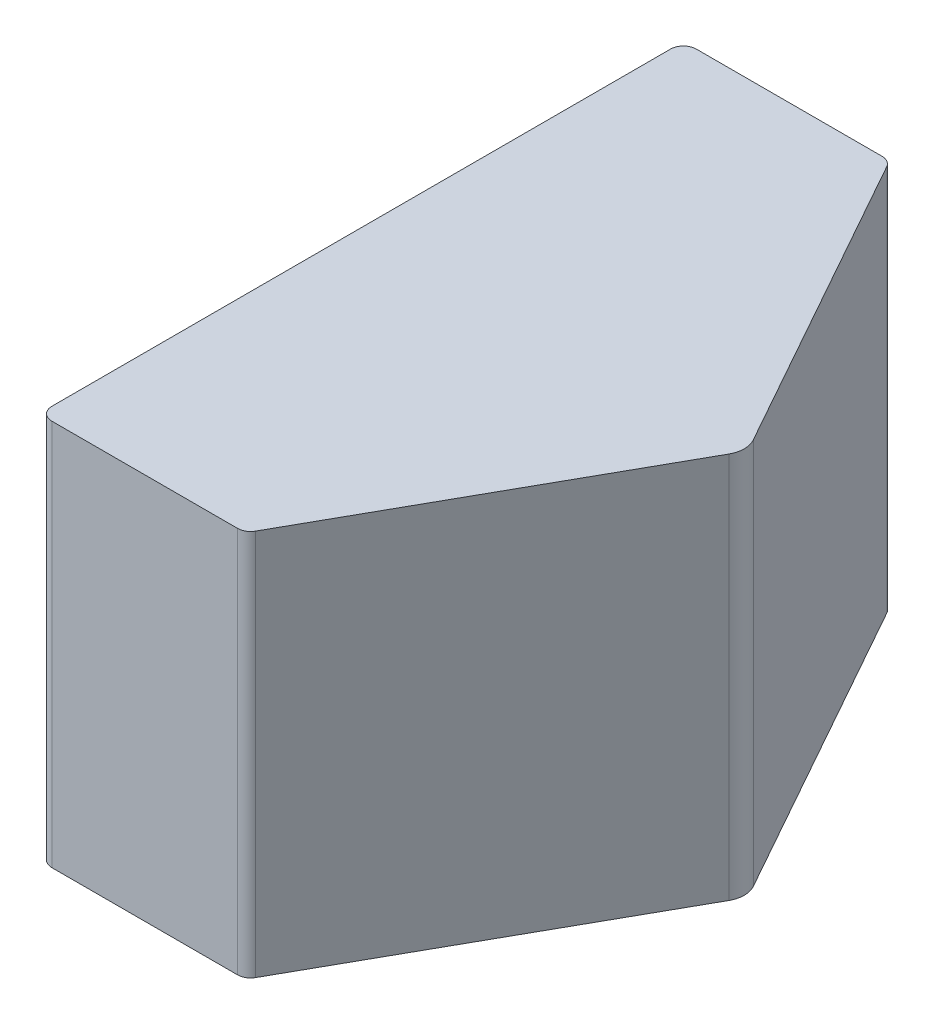
ISO-10303-21;
HEADER;
FILE_DESCRIPTION(('STEP AP214'),'2;1');
FILE_NAME('part.step','',(''),(''),'','','');
FILE_SCHEMA(('AUTOMOTIVE_DESIGN { 1 0 10303 214 1 1 1 1 }'));
ENDSEC;
DATA;
#1=APPLICATION_CONTEXT('core data for automotive mechanical design processes');
#2=APPLICATION_PROTOCOL_DEFINITION('international standard','automotive_design',2000,#1);
#3=PRODUCT_CONTEXT('',#1,'mechanical');
#4=PRODUCT('Part','Part','',(#3));
#5=PRODUCT_RELATED_PRODUCT_CATEGORY('part','',(#4));
#6=PRODUCT_DEFINITION_FORMATION('','',#4);
#7=PRODUCT_DEFINITION_CONTEXT('part definition',#1,'design');
#8=PRODUCT_DEFINITION('design','',#6,#7);
#9=PRODUCT_DEFINITION_SHAPE('','',#8);
#10=(LENGTH_UNIT() NAMED_UNIT(*) SI_UNIT(.MILLI.,.METRE.));
#11=(NAMED_UNIT(*) PLANE_ANGLE_UNIT() SI_UNIT($,.RADIAN.));
#12=(NAMED_UNIT(*) SI_UNIT($,.STERADIAN.) SOLID_ANGLE_UNIT());
#13=UNCERTAINTY_MEASURE_WITH_UNIT(LENGTH_MEASURE(1.E-05),#10,'distance_accuracy_value','');
#14=(GEOMETRIC_REPRESENTATION_CONTEXT(3) GLOBAL_UNCERTAINTY_ASSIGNED_CONTEXT((#13)) GLOBAL_UNIT_ASSIGNED_CONTEXT((#10,
#11,#12)) REPRESENTATION_CONTEXT('',''));
#15=CARTESIAN_POINT('',(0.,0.,0.));
#16=DIRECTION('',(0.,0.,1.));
#17=DIRECTION('',(1.,0.,0.));
#18=AXIS2_PLACEMENT_3D('',#15,#16,#17);
#19=CARTESIAN_POINT('',(138.907318907006,150.,125.));
#20=DIRECTION('',(0.,-1.,0.));
#21=DIRECTION('',(0.,0.,-1.));
#22=AXIS2_PLACEMENT_3D('',#19,#20,#21);
#23=CYLINDRICAL_SURFACE('',#22,9.67843098664906);
#24=CARTESIAN_POINT('',(138.907318907006,0.,125.));
#25=DIRECTION('',(0.,1.,0.));
#26=DIRECTION('',(0.,0.,1.));
#27=AXIS2_PLACEMENT_3D('',#24,#25,#26);
#28=CIRCLE('',#27,9.67843098664906);
#29=CARTESIAN_POINT('',(147.351808167811,0.,129.728913986051));
#30=VERTEX_POINT('',#29);
#31=CARTESIAN_POINT('',(147.351808167811,0.,120.271086013949));
#32=VERTEX_POINT('',#31);
#33=EDGE_CURVE('E159',#30,#32,#28,.T.);
#34=ORIENTED_EDGE('',*,*,#33,.T.);
#35=DIRECTION('',(0.,-1.,0.));
#36=VECTOR('',#35,1.);
#37=CARTESIAN_POINT('',(147.351808167811,150.,120.271086013949));
#38=LINE('',#37,#36);
#39=CARTESIAN_POINT('',(147.351808167811,150.,120.271086013949));
#40=VERTEX_POINT('',#39);
#41=EDGE_CURVE('E11',#40,#32,#38,.T.);
#42=ORIENTED_EDGE('',*,*,#41,.F.);
#43=CARTESIAN_POINT('',(138.907318907006,150.,125.));
#44=DIRECTION('',(0.,1.,0.));
#45=DIRECTION('',(0.,0.,1.));
#46=AXIS2_PLACEMENT_3D('',#43,#44,#45);
#47=CIRCLE('',#46,9.67843098664906);
#48=CARTESIAN_POINT('',(147.351808167811,150.,129.728913986051));
#49=VERTEX_POINT('',#48);
#50=EDGE_CURVE('E181',#49,#40,#47,.T.);
#51=ORIENTED_EDGE('',*,*,#50,.F.);
#52=DIRECTION('',(0.,-1.,0.));
#53=VECTOR('',#52,1.);
#54=CARTESIAN_POINT('',(147.351808167811,150.,129.728913986051));
#55=LINE('',#54,#53);
#56=EDGE_CURVE('E155',#49,#30,#55,.T.);
#57=ORIENTED_EDGE('',*,*,#56,.T.);
#58=EDGE_LOOP('',(#34,#42,#51,#57));
#59=FACE_BOUND('',#58,.T.);
#60=ADVANCED_FACE('F39',(#59),#23,.T.);
#61=CARTESIAN_POINT('',(81.4319105669908,150.,2.5569831553408));
#62=DIRECTION('',(-0.87250601594972,0.,0.488603368931844));
#63=DIRECTION('',(0.488603368931844,0.,0.87250601594972));
#64=AXIS2_PLACEMENT_3D('',#61,#62,#63);
#65=PLANE('',#64);
#66=DIRECTION('',(-0.488603368931844,0.,-0.87250601594972));
#67=VECTOR('',#66,1.);
#68=CARTESIAN_POINT('',(81.4319105669908,0.,2.5569831553408));
#69=LINE('',#68,#67);
#70=CARTESIAN_POINT('',(81.4319105669908,0.,2.5569831553408));
#71=VERTEX_POINT('',#70);
#72=EDGE_CURVE('E162',#32,#71,#69,.T.);
#73=ORIENTED_EDGE('',*,*,#72,.T.);
#74=DIRECTION('',(0.,-1.,0.));
#75=VECTOR('',#74,1.);
#76=CARTESIAN_POINT('',(81.4319105669908,150.,2.5569831553408));
#77=LINE('',#76,#75);
#78=CARTESIAN_POINT('',(81.4319105669908,150.,2.5569831553408));
#79=VERTEX_POINT('',#78);
#80=EDGE_CURVE('E46',#79,#71,#77,.T.);
#81=ORIENTED_EDGE('',*,*,#80,.F.);
#82=DIRECTION('',(-0.488603368931844,0.,-0.87250601594972));
#83=VECTOR('',#82,1.);
#84=CARTESIAN_POINT('',(81.4319105669908,150.,2.5569831553408));
#85=LINE('',#84,#83);
#86=EDGE_CURVE('E109',#40,#79,#85,.T.);
#87=ORIENTED_EDGE('',*,*,#86,.F.);
#88=ORIENTED_EDGE('',*,*,#41,.T.);
#89=EDGE_LOOP('',(#73,#81,#87,#88));
#90=FACE_BOUND('',#89,.T.);
#91=ADVANCED_FACE('F292',(#90),#65,.F.);
#92=CARTESIAN_POINT('',(77.0693804872422,150.,5.));
#93=DIRECTION('',(0.,-1.,0.));
#94=DIRECTION('',(0.,0.,-1.));
#95=AXIS2_PLACEMENT_3D('',#92,#93,#94);
#96=CYLINDRICAL_SURFACE('',#95,5.00000000000001);
#97=CARTESIAN_POINT('',(77.0693804872422,0.,5.));
#98=DIRECTION('',(0.,1.,0.));
#99=DIRECTION('',(0.,0.,-1.));
#100=AXIS2_PLACEMENT_3D('',#97,#98,#99);
#101=CIRCLE('',#100,5.00000000000001);
#102=CARTESIAN_POINT('',(77.0693804872422,0.,0.));
#103=VERTEX_POINT('',#102);
#104=EDGE_CURVE('E165',#71,#103,#101,.T.);
#105=ORIENTED_EDGE('',*,*,#104,.T.);
#106=DIRECTION('',(0.,-1.,0.));
#107=VECTOR('',#106,1.);
#108=CARTESIAN_POINT('',(77.0693804872422,150.,0.));
#109=LINE('',#108,#107);
#110=CARTESIAN_POINT('',(77.0693804872422,150.,0.));
#111=VERTEX_POINT('',#110);
#112=EDGE_CURVE('E194',#111,#103,#109,.T.);
#113=ORIENTED_EDGE('',*,*,#112,.F.);
#114=CARTESIAN_POINT('',(77.0693804872422,150.,5.));
#115=DIRECTION('',(0.,1.,0.));
#116=DIRECTION('',(0.,0.,-1.));
#117=AXIS2_PLACEMENT_3D('',#114,#115,#116);
#118=CIRCLE('',#117,5.00000000000001);
#119=EDGE_CURVE('E202',#79,#111,#118,.T.);
#120=ORIENTED_EDGE('',*,*,#119,.F.);
#121=ORIENTED_EDGE('',*,*,#80,.T.);
#122=EDGE_LOOP('',(#105,#113,#120,#121));
#123=FACE_BOUND('',#122,.T.);
#124=ADVANCED_FACE('F200',(#123),#96,.T.);
#125=CARTESIAN_POINT('',(5.00000000000004,150.,0.));
#126=DIRECTION('',(0.,0.,1.));
#127=DIRECTION('',(1.,0.,0.));
#128=AXIS2_PLACEMENT_3D('',#125,#126,#127);
#129=PLANE('',#128);
#130=DIRECTION('',(-1.,0.,0.));
#131=VECTOR('',#130,1.);
#132=CARTESIAN_POINT('',(5.00000000000004,0.,0.));
#133=LINE('',#132,#131);
#134=CARTESIAN_POINT('',(5.,0.,0.));
#135=VERTEX_POINT('',#134);
#136=EDGE_CURVE('E167',#103,#135,#133,.T.);
#137=ORIENTED_EDGE('',*,*,#136,.T.);
#138=DIRECTION('',(0.,-1.,0.));
#139=VECTOR('',#138,1.);
#140=CARTESIAN_POINT('',(5.,150.,0.));
#141=LINE('',#140,#139);
#142=CARTESIAN_POINT('',(5.,150.,0.));
#143=VERTEX_POINT('',#142);
#144=EDGE_CURVE('E191',#143,#135,#141,.T.);
#145=ORIENTED_EDGE('',*,*,#144,.F.);
#146=DIRECTION('',(-1.,0.,0.));
#147=VECTOR('',#146,1.);
#148=CARTESIAN_POINT('',(5.00000000000004,150.,0.));
#149=LINE('',#148,#147);
#150=EDGE_CURVE('E221',#111,#143,#149,.T.);
#151=ORIENTED_EDGE('',*,*,#150,.F.);
#152=ORIENTED_EDGE('',*,*,#112,.T.);
#153=EDGE_LOOP('',(#137,#145,#151,#152));
#154=FACE_BOUND('',#153,.T.);
#155=ADVANCED_FACE('F212',(#154),#129,.F.);
#156=CARTESIAN_POINT('',(5.,150.,5.));
#157=DIRECTION('',(0.,-1.,0.));
#158=DIRECTION('',(0.,0.,-1.));
#159=AXIS2_PLACEMENT_3D('',#156,#157,#158);
#160=CYLINDRICAL_SURFACE('',#159,5.);
#161=CARTESIAN_POINT('',(5.,0.,5.));
#162=DIRECTION('',(0.,1.,0.));
#163=DIRECTION('',(0.,0.,-1.));
#164=AXIS2_PLACEMENT_3D('',#161,#162,#163);
#165=CIRCLE('',#164,5.);
#166=CARTESIAN_POINT('',(0.,0.,5.00000000000004));
#167=VERTEX_POINT('',#166);
#168=EDGE_CURVE('E169',#135,#167,#165,.T.);
#169=ORIENTED_EDGE('',*,*,#168,.T.);
#170=DIRECTION('',(0.,-1.,0.));
#171=VECTOR('',#170,1.);
#172=CARTESIAN_POINT('',(0.,150.,5.00000000000004));
#173=LINE('',#172,#171);
#174=CARTESIAN_POINT('',(0.,150.,5.00000000000004));
#175=VERTEX_POINT('',#174);
#176=EDGE_CURVE('E188',#175,#167,#173,.T.);
#177=ORIENTED_EDGE('',*,*,#176,.F.);
#178=CARTESIAN_POINT('',(5.,150.,5.));
#179=DIRECTION('',(0.,1.,0.));
#180=DIRECTION('',(0.,0.,-1.));
#181=AXIS2_PLACEMENT_3D('',#178,#179,#180);
#182=CIRCLE('',#181,5.);
#183=EDGE_CURVE('E218',#143,#175,#182,.T.);
#184=ORIENTED_EDGE('',*,*,#183,.F.);
#185=ORIENTED_EDGE('',*,*,#144,.T.);
#186=EDGE_LOOP('',(#169,#177,#184,#185));
#187=FACE_BOUND('',#186,.T.);
#188=ADVANCED_FACE('F216',(#187),#160,.T.);
#189=CARTESIAN_POINT('',(0.,150.,5.00000000000004));
#190=DIRECTION('',(1.,0.,0.));
#191=DIRECTION('',(0.,0.,-1.));
#192=AXIS2_PLACEMENT_3D('',#189,#190,#191);
#193=PLANE('',#192);
#194=DIRECTION('',(0.,0.,1.));
#195=VECTOR('',#194,1.);
#196=CARTESIAN_POINT('',(0.,0.,5.00000000000004));
#197=LINE('',#196,#195);
#198=CARTESIAN_POINT('',(0.,0.,85.));
#199=VERTEX_POINT('',#198);
#200=EDGE_CURVE('E172',#167,#199,#197,.T.);
#201=ORIENTED_EDGE('',*,*,#200,.T.);
#202=DIRECTION('',(0.,-1.,0.));
#203=VECTOR('',#202,1.);
#204=CARTESIAN_POINT('',(0.,80.,85.));
#205=LINE('',#204,#203);
#206=CARTESIAN_POINT('',(0.,80.,85.));
#207=VERTEX_POINT('',#206);
#208=EDGE_CURVE('E247',#207,#199,#205,.T.);
#209=ORIENTED_EDGE('',*,*,#208,.F.);
#210=DIRECTION('',(0.,0.,-1.));
#211=VECTOR('',#210,1.);
#212=CARTESIAN_POINT('',(0.,80.,85.));
#213=LINE('',#212,#211);
#214=CARTESIAN_POINT('',(0.,80.,165.));
#215=VERTEX_POINT('',#214);
#216=EDGE_CURVE('E241',#215,#207,#213,.T.);
#217=ORIENTED_EDGE('',*,*,#216,.F.);
#218=DIRECTION('',(0.,1.,0.));
#219=VECTOR('',#218,1.);
#220=CARTESIAN_POINT('',(0.,80.,165.));
#221=LINE('',#220,#219);
#222=CARTESIAN_POINT('',(0.,0.,165.));
#223=VERTEX_POINT('',#222);
#224=EDGE_CURVE('E244',#223,#215,#221,.T.);
#225=ORIENTED_EDGE('',*,*,#224,.F.);
#226=CARTESIAN_POINT('',(0.,0.,245.));
#227=VERTEX_POINT('',#226);
#228=EDGE_CURVE('E171',#223,#227,#197,.T.);
#229=ORIENTED_EDGE('',*,*,#228,.T.);
#230=DIRECTION('',(0.,-1.,0.));
#231=VECTOR('',#230,1.);
#232=CARTESIAN_POINT('',(0.,150.,245.));
#233=LINE('',#232,#231);
#234=CARTESIAN_POINT('',(0.,150.,245.));
#235=VERTEX_POINT('',#234);
#236=EDGE_CURVE('E185',#235,#227,#233,.T.);
#237=ORIENTED_EDGE('',*,*,#236,.F.);
#238=DIRECTION('',(0.,0.,1.));
#239=VECTOR('',#238,1.);
#240=CARTESIAN_POINT('',(0.,150.,5.00000000000004));
#241=LINE('',#240,#239);
#242=EDGE_CURVE('E220',#175,#235,#241,.T.);
#243=ORIENTED_EDGE('',*,*,#242,.F.);
#244=ORIENTED_EDGE('',*,*,#176,.T.);
#245=EDGE_LOOP('',(#201,#209,#217,#225,#229,#237,#243,#244));
#246=FACE_BOUND('',#245,.T.);
#247=ADVANCED_FACE('F275',(#246),#193,.F.);
#248=CARTESIAN_POINT('',(5.00000000000003,150.,245.));
#249=DIRECTION('',(0.,-1.,0.));
#250=DIRECTION('',(0.,0.,-1.));
#251=AXIS2_PLACEMENT_3D('',#248,#249,#250);
#252=CYLINDRICAL_SURFACE('',#251,5.);
#253=CARTESIAN_POINT('',(5.00000000000003,0.,245.));
#254=DIRECTION('',(0.,1.,0.));
#255=DIRECTION('',(0.,0.,1.));
#256=AXIS2_PLACEMENT_3D('',#253,#254,#255);
#257=CIRCLE('',#256,5.);
#258=CARTESIAN_POINT('',(5.00000000000003,0.,250.));
#259=VERTEX_POINT('',#258);
#260=EDGE_CURVE('E175',#227,#259,#257,.T.);
#261=ORIENTED_EDGE('',*,*,#260,.T.);
#262=DIRECTION('',(0.,-1.,0.));
#263=VECTOR('',#262,1.);
#264=CARTESIAN_POINT('',(5.00000000000003,150.,250.));
#265=LINE('',#264,#263);
#266=CARTESIAN_POINT('',(5.00000000000003,150.,250.));
#267=VERTEX_POINT('',#266);
#268=EDGE_CURVE('E150',#267,#259,#265,.T.);
#269=ORIENTED_EDGE('',*,*,#268,.F.);
#270=CARTESIAN_POINT('',(5.00000000000003,150.,245.));
#271=DIRECTION('',(0.,1.,0.));
#272=DIRECTION('',(0.,0.,1.));
#273=AXIS2_PLACEMENT_3D('',#270,#271,#272);
#274=CIRCLE('',#273,5.);
#275=EDGE_CURVE('E138',#235,#267,#274,.T.);
#276=ORIENTED_EDGE('',*,*,#275,.F.);
#277=ORIENTED_EDGE('',*,*,#236,.T.);
#278=EDGE_LOOP('',(#261,#269,#276,#277));
#279=FACE_BOUND('',#278,.T.);
#280=ADVANCED_FACE('F287',(#279),#252,.T.);
#281=CARTESIAN_POINT('',(5.00000000000003,150.,250.));
#282=DIRECTION('',(0.,0.,-1.));
#283=DIRECTION('',(-1.,0.,0.));
#284=AXIS2_PLACEMENT_3D('',#281,#282,#283);
#285=PLANE('',#284);
#286=DIRECTION('',(1.,0.,0.));
#287=VECTOR('',#286,1.);
#288=CARTESIAN_POINT('',(5.00000000000003,0.,250.));
#289=LINE('',#288,#287);
#290=CARTESIAN_POINT('',(77.0693804872422,0.,250.));
#291=VERTEX_POINT('',#290);
#292=EDGE_CURVE('E147',#259,#291,#289,.T.);
#293=ORIENTED_EDGE('',*,*,#292,.T.);
#294=DIRECTION('',(0.,-1.,0.));
#295=VECTOR('',#294,1.);
#296=CARTESIAN_POINT('',(77.0693804872422,150.,250.));
#297=LINE('',#296,#295);
#298=CARTESIAN_POINT('',(77.0693804872422,150.,250.));
#299=VERTEX_POINT('',#298);
#300=EDGE_CURVE('E144',#299,#291,#297,.T.);
#301=ORIENTED_EDGE('',*,*,#300,.F.);
#302=DIRECTION('',(1.,0.,0.));
#303=VECTOR('',#302,1.);
#304=CARTESIAN_POINT('',(5.00000000000003,150.,250.));
#305=LINE('',#304,#303);
#306=EDGE_CURVE('E131',#267,#299,#305,.T.);
#307=ORIENTED_EDGE('',*,*,#306,.F.);
#308=ORIENTED_EDGE('',*,*,#268,.T.);
#309=EDGE_LOOP('',(#293,#301,#307,#308));
#310=FACE_BOUND('',#309,.T.);
#311=ADVANCED_FACE('F145',(#310),#285,.F.);
#312=CARTESIAN_POINT('',(77.0693804872422,150.,245.));
#313=DIRECTION('',(0.,-1.,0.));
#314=DIRECTION('',(0.,0.,-1.));
#315=AXIS2_PLACEMENT_3D('',#312,#313,#314);
#316=CYLINDRICAL_SURFACE('',#315,5.00000000000001);
#317=CARTESIAN_POINT('',(77.0693804872422,0.,245.));
#318=DIRECTION('',(0.,1.,0.));
#319=DIRECTION('',(0.,0.,-1.));
#320=AXIS2_PLACEMENT_3D('',#317,#318,#319);
#321=CIRCLE('',#320,5.00000000000001);
#322=CARTESIAN_POINT('',(81.4319105669908,0.,247.443016844659));
#323=VERTEX_POINT('',#322);
#324=EDGE_CURVE('E178',#291,#323,#321,.T.);
#325=ORIENTED_EDGE('',*,*,#324,.T.);
#326=DIRECTION('',(0.,-1.,0.));
#327=VECTOR('',#326,1.);
#328=CARTESIAN_POINT('',(81.4319105669908,150.,247.443016844659));
#329=LINE('',#328,#327);
#330=CARTESIAN_POINT('',(81.4319105669908,150.,247.443016844659));
#331=VERTEX_POINT('',#330);
#332=EDGE_CURVE('E151',#331,#323,#329,.T.);
#333=ORIENTED_EDGE('',*,*,#332,.F.);
#334=CARTESIAN_POINT('',(77.0693804872422,150.,245.));
#335=DIRECTION('',(0.,1.,0.));
#336=DIRECTION('',(0.,0.,-1.));
#337=AXIS2_PLACEMENT_3D('',#334,#335,#336);
#338=CIRCLE('',#337,5.00000000000001);
#339=EDGE_CURVE('E135',#299,#331,#338,.T.);
#340=ORIENTED_EDGE('',*,*,#339,.F.);
#341=ORIENTED_EDGE('',*,*,#300,.T.);
#342=EDGE_LOOP('',(#325,#333,#340,#341));
#343=FACE_BOUND('',#342,.T.);
#344=ADVANCED_FACE('F153',(#343),#316,.T.);
#345=CARTESIAN_POINT('',(147.351808167811,150.,129.728913986051));
#346=DIRECTION('',(-0.87250601594972,0.,-0.488603368931844));
#347=DIRECTION('',(-0.488603368931844,0.,0.87250601594972));
#348=AXIS2_PLACEMENT_3D('',#345,#346,#347);
#349=PLANE('',#348);
#350=DIRECTION('',(0.488603368931844,0.,-0.87250601594972));
#351=VECTOR('',#350,1.);
#352=CARTESIAN_POINT('',(147.351808167811,0.,129.728913986051));
#353=LINE('',#352,#351);
#354=EDGE_CURVE('E101',#323,#30,#353,.T.);
#355=ORIENTED_EDGE('',*,*,#354,.T.);
#356=ORIENTED_EDGE('',*,*,#56,.F.);
#357=DIRECTION('',(0.488603368931844,0.,-0.87250601594972));
#358=VECTOR('',#357,1.);
#359=CARTESIAN_POINT('',(147.351808167811,150.,129.728913986051));
#360=LINE('',#359,#358);
#361=EDGE_CURVE('E62',#331,#49,#360,.T.);
#362=ORIENTED_EDGE('',*,*,#361,.F.);
#363=ORIENTED_EDGE('',*,*,#332,.T.);
#364=EDGE_LOOP('',(#355,#356,#362,#363));
#365=FACE_BOUND('',#364,.T.);
#366=ADVANCED_FACE('F288',(#365),#349,.F.);
#367=CARTESIAN_POINT('',(138.907318907006,150.,125.));
#368=DIRECTION('',(0.,1.,0.));
#369=DIRECTION('',(0.,0.,1.));
#370=AXIS2_PLACEMENT_3D('',#367,#368,#369);
#371=PLANE('',#370);
#372=ORIENTED_EDGE('',*,*,#50,.T.);
#373=ORIENTED_EDGE('',*,*,#86,.T.);
#374=ORIENTED_EDGE('',*,*,#119,.T.);
#375=ORIENTED_EDGE('',*,*,#150,.T.);
#376=ORIENTED_EDGE('',*,*,#183,.T.);
#377=ORIENTED_EDGE('',*,*,#242,.T.);
#378=ORIENTED_EDGE('',*,*,#275,.T.);
#379=ORIENTED_EDGE('',*,*,#306,.T.);
#380=ORIENTED_EDGE('',*,*,#339,.T.);
#381=ORIENTED_EDGE('',*,*,#361,.T.);
#382=EDGE_LOOP('',(#372,#373,#374,#375,#376,#377,#378,#379,#380,#381));
#383=FACE_BOUND('',#382,.T.);
#384=ADVANCED_FACE('F133',(#383),#371,.T.);
#385=CARTESIAN_POINT('',(138.907318907006,0.,125.));
#386=DIRECTION('',(0.,1.,0.));
#387=DIRECTION('',(0.,0.,1.));
#388=AXIS2_PLACEMENT_3D('',#385,#386,#387);
#389=PLANE('',#388);
#390=DIRECTION('',(0.,0.,1.));
#391=VECTOR('',#390,1.);
#392=CARTESIAN_POINT('',(100.,0.,85.));
#393=LINE('',#392,#391);
#394=CARTESIAN_POINT('',(100.,0.,85.));
#395=VERTEX_POINT('',#394);
#396=CARTESIAN_POINT('',(100.,0.,165.));
#397=VERTEX_POINT('',#396);
#398=EDGE_CURVE('E254',#395,#397,#393,.T.);
#399=ORIENTED_EDGE('',*,*,#398,.F.);
#400=DIRECTION('',(-1.,0.,0.));
#401=VECTOR('',#400,1.);
#402=CARTESIAN_POINT('',(100.,0.,85.));
#403=LINE('',#402,#401);
#404=EDGE_CURVE('E229',#395,#199,#403,.T.);
#405=ORIENTED_EDGE('',*,*,#404,.T.);
#406=ORIENTED_EDGE('',*,*,#200,.F.);
#407=ORIENTED_EDGE('',*,*,#168,.F.);
#408=ORIENTED_EDGE('',*,*,#136,.F.);
#409=ORIENTED_EDGE('',*,*,#104,.F.);
#410=ORIENTED_EDGE('',*,*,#72,.F.);
#411=ORIENTED_EDGE('',*,*,#33,.F.);
#412=ORIENTED_EDGE('',*,*,#354,.F.);
#413=ORIENTED_EDGE('',*,*,#324,.F.);
#414=ORIENTED_EDGE('',*,*,#292,.F.);
#415=ORIENTED_EDGE('',*,*,#260,.F.);
#416=ORIENTED_EDGE('',*,*,#228,.F.);
#417=DIRECTION('',(-1.,0.,0.));
#418=VECTOR('',#417,1.);
#419=CARTESIAN_POINT('',(100.,0.,165.));
#420=LINE('',#419,#418);
#421=EDGE_CURVE('E232',#397,#223,#420,.T.);
#422=ORIENTED_EDGE('',*,*,#421,.F.);
#423=EDGE_LOOP('',(#399,#405,#406,#407,#408,#409,#410,#411,#412,#413,#414,#415,#416,#422));
#424=FACE_BOUND('',#423,.T.);
#425=ADVANCED_FACE('F206',(#424),#389,.F.);
#426=CARTESIAN_POINT('',(100.,80.,85.));
#427=DIRECTION('',(0.,0.,-1.));
#428=DIRECTION('',(0.,1.,0.));
#429=AXIS2_PLACEMENT_3D('',#426,#427,#428);
#430=PLANE('',#429);
#431=ORIENTED_EDGE('',*,*,#208,.T.);
#432=ORIENTED_EDGE('',*,*,#404,.F.);
#433=DIRECTION('',(0.,-1.,0.));
#434=VECTOR('',#433,1.);
#435=CARTESIAN_POINT('',(100.,80.,85.));
#436=LINE('',#435,#434);
#437=CARTESIAN_POINT('',(100.,80.,85.));
#438=VERTEX_POINT('',#437);
#439=EDGE_CURVE('E53',#438,#395,#436,.T.);
#440=ORIENTED_EDGE('',*,*,#439,.F.);
#441=DIRECTION('',(-1.,0.,0.));
#442=VECTOR('',#441,1.);
#443=CARTESIAN_POINT('',(100.,80.,85.));
#444=LINE('',#443,#442);
#445=EDGE_CURVE('E163',#438,#207,#444,.T.);
#446=ORIENTED_EDGE('',*,*,#445,.T.);
#447=EDGE_LOOP('',(#431,#432,#440,#446));
#448=FACE_BOUND('',#447,.T.);
#449=ADVANCED_FACE('F282',(#448),#430,.F.);
#450=CARTESIAN_POINT('',(100.,80.,85.));
#451=DIRECTION('',(0.,1.,0.));
#452=DIRECTION('',(0.,0.,1.));
#453=AXIS2_PLACEMENT_3D('',#450,#451,#452);
#454=PLANE('',#453);
#455=ORIENTED_EDGE('',*,*,#216,.T.);
#456=ORIENTED_EDGE('',*,*,#445,.F.);
#457=DIRECTION('',(0.,0.,-1.));
#458=VECTOR('',#457,1.);
#459=CARTESIAN_POINT('',(100.,80.,85.));
#460=LINE('',#459,#458);
#461=CARTESIAN_POINT('',(100.,80.,165.));
#462=VERTEX_POINT('',#461);
#463=EDGE_CURVE('E233',#462,#438,#460,.T.);
#464=ORIENTED_EDGE('',*,*,#463,.F.);
#465=DIRECTION('',(-1.,0.,0.));
#466=VECTOR('',#465,1.);
#467=CARTESIAN_POINT('',(100.,80.,165.));
#468=LINE('',#467,#466);
#469=EDGE_CURVE('E236',#462,#215,#468,.T.);
#470=ORIENTED_EDGE('',*,*,#469,.T.);
#471=EDGE_LOOP('',(#455,#456,#464,#470));
#472=FACE_BOUND('',#471,.T.);
#473=ADVANCED_FACE('F280',(#472),#454,.F.);
#474=CARTESIAN_POINT('',(100.,80.,165.));
#475=DIRECTION('',(0.,0.,1.));
#476=DIRECTION('',(1.,0.,0.));
#477=AXIS2_PLACEMENT_3D('',#474,#475,#476);
#478=PLANE('',#477);
#479=ORIENTED_EDGE('',*,*,#224,.T.);
#480=ORIENTED_EDGE('',*,*,#469,.F.);
#481=DIRECTION('',(0.,1.,0.));
#482=VECTOR('',#481,1.);
#483=CARTESIAN_POINT('',(100.,80.,165.));
#484=LINE('',#483,#482);
#485=EDGE_CURVE('E251',#397,#462,#484,.T.);
#486=ORIENTED_EDGE('',*,*,#485,.F.);
#487=ORIENTED_EDGE('',*,*,#421,.T.);
#488=EDGE_LOOP('',(#479,#480,#486,#487));
#489=FACE_BOUND('',#488,.T.);
#490=ADVANCED_FACE('F268',(#489),#478,.F.);
#491=CARTESIAN_POINT('',(100.,0.,0.));
#492=DIRECTION('',(-1.,0.,0.));
#493=DIRECTION('',(0.,0.,1.));
#494=AXIS2_PLACEMENT_3D('',#491,#492,#493);
#495=PLANE('',#494);
#496=ORIENTED_EDGE('',*,*,#439,.T.);
#497=ORIENTED_EDGE('',*,*,#398,.T.);
#498=ORIENTED_EDGE('',*,*,#485,.T.);
#499=ORIENTED_EDGE('',*,*,#463,.T.);
#500=EDGE_LOOP('',(#496,#497,#498,#499));
#501=FACE_BOUND('',#500,.T.);
#502=ADVANCED_FACE('F258',(#501),#495,.T.);
#503=CLOSED_SHELL('',(#60,#91,#124,#155,#188,#247,#280,#311,#344,#366,#384,#425,#449,#473,#490,#502));
#504=MANIFOLD_SOLID_BREP('B2',#503);
#505=ADVANCED_BREP_SHAPE_REPRESENTATION('',(#18,#504),#14);
#506=SHAPE_DEFINITION_REPRESENTATION(#9,#505);
ENDSEC;
END-ISO-10303-21;
